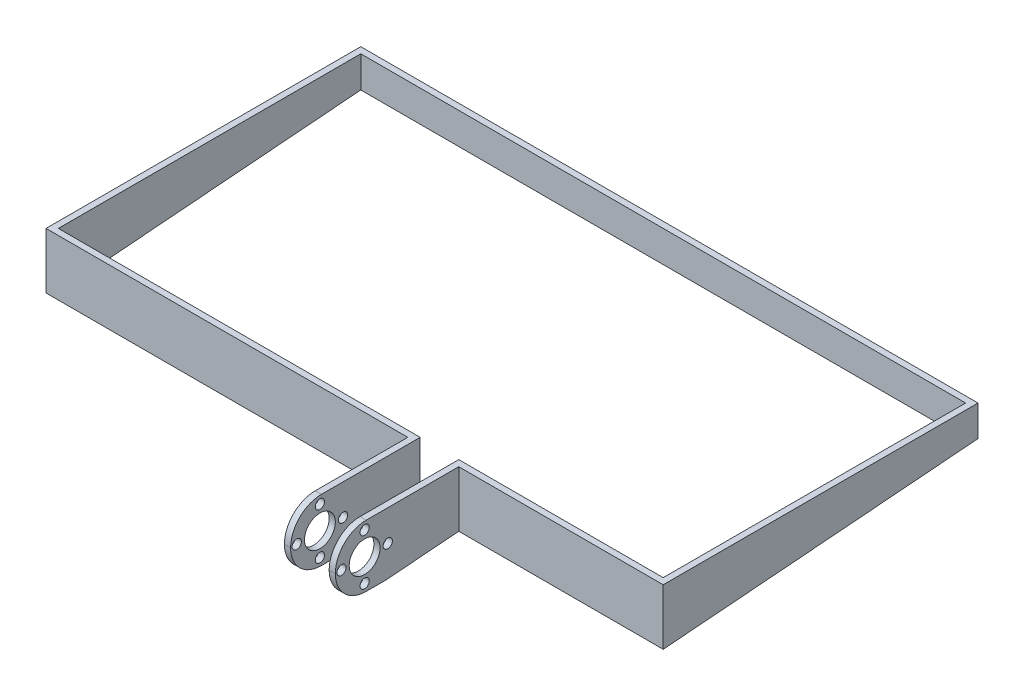
ISO-10303-21;
HEADER;
FILE_DESCRIPTION(('STEP AP214'),'2;1');
FILE_NAME('part.step','',(''),(''),'','','');
FILE_SCHEMA(('AUTOMOTIVE_DESIGN { 1 0 10303 214 1 1 1 1 }'));
ENDSEC;
DATA;
#1=APPLICATION_CONTEXT('core data for automotive mechanical design processes');
#2=APPLICATION_PROTOCOL_DEFINITION('international standard','automotive_design',2000,#1);
#3=PRODUCT_CONTEXT('',#1,'mechanical');
#4=PRODUCT('Part','Part','',(#3));
#5=PRODUCT_RELATED_PRODUCT_CATEGORY('part','',(#4));
#6=PRODUCT_DEFINITION_FORMATION('','',#4);
#7=PRODUCT_DEFINITION_CONTEXT('part definition',#1,'design');
#8=PRODUCT_DEFINITION('design','',#6,#7);
#9=PRODUCT_DEFINITION_SHAPE('','',#8);
#10=(LENGTH_UNIT() NAMED_UNIT(*) SI_UNIT(.MILLI.,.METRE.));
#11=(NAMED_UNIT(*) PLANE_ANGLE_UNIT() SI_UNIT($,.RADIAN.));
#12=(NAMED_UNIT(*) SI_UNIT($,.STERADIAN.) SOLID_ANGLE_UNIT());
#13=UNCERTAINTY_MEASURE_WITH_UNIT(LENGTH_MEASURE(1.E-05),#10,'distance_accuracy_value','');
#14=(GEOMETRIC_REPRESENTATION_CONTEXT(3) GLOBAL_UNCERTAINTY_ASSIGNED_CONTEXT((#13)) GLOBAL_UNIT_ASSIGNED_CONTEXT((#10,
#11,#12)) REPRESENTATION_CONTEXT('',''));
#15=CARTESIAN_POINT('',(0.,0.,0.));
#16=DIRECTION('',(0.,0.,1.));
#17=DIRECTION('',(1.,0.,0.));
#18=AXIS2_PLACEMENT_3D('',#15,#16,#17);
#19=CARTESIAN_POINT('',(-100.,20.,36.2145653136531));
#20=DIRECTION('',(1.,0.,0.));
#21=DIRECTION('',(0.,0.,-1.));
#22=AXIS2_PLACEMENT_3D('',#19,#20,#21);
#23=PLANE('',#22);
#24=DIRECTION('',(0.,-1.,0.));
#25=VECTOR('',#24,1.);
#26=CARTESIAN_POINT('',(-100.,20.,18.2145653136531));
#27=LINE('',#26,#25);
#28=CARTESIAN_POINT('',(-100.,20.,18.2145653136531));
#29=VERTEX_POINT('',#28);
#30=CARTESIAN_POINT('',(-100.,1.87829380653774,18.2145653136531));
#31=VERTEX_POINT('',#30);
#32=EDGE_CURVE('E200',#29,#31,#27,.T.);
#33=ORIENTED_EDGE('',*,*,#32,.F.);
#34=DIRECTION('',(0.,0.,1.));
#35=VECTOR('',#34,1.);
#36=CARTESIAN_POINT('',(-100.,20.,36.2145653136531));
#37=LINE('',#36,#35);
#38=CARTESIAN_POINT('',(-100.,20.,-83.7854346863469));
#39=VERTEX_POINT('',#38);
#40=EDGE_CURVE('E232',#39,#29,#37,.T.);
#41=ORIENTED_EDGE('',*,*,#40,.F.);
#42=DIRECTION('',(0.,-1.,0.));
#43=VECTOR('',#42,1.);
#44=CARTESIAN_POINT('',(-100.,20.,-83.7854346863469));
#45=LINE('',#44,#43);
#46=CARTESIAN_POINT('',(-99.9999999999999,10.,-83.7854346863469));
#47=VERTEX_POINT('',#46);
#48=EDGE_CURVE('E211',#39,#47,#45,.T.);
#49=ORIENTED_EDGE('',*,*,#48,.T.);
#50=DIRECTION('',(0.,-0.0793733516899173,0.996844958376933));
#51=VECTOR('',#50,1.);
#52=CARTESIAN_POINT('',(-100.,0.568250234196127,34.6673205840184));
#53=LINE('',#52,#51);
#54=EDGE_CURVE('E320',#47,#31,#53,.T.);
#55=ORIENTED_EDGE('',*,*,#54,.T.);
#56=EDGE_LOOP('',(#33,#41,#49,#55));
#57=FACE_BOUND('',#56,.T.);
#58=ADVANCED_FACE('F39',(#57),#23,.F.);
#59=CARTESIAN_POINT('',(100.,20.,36.2145653136531));
#60=DIRECTION('',(-1.,0.,0.));
#61=DIRECTION('',(0.,0.,1.));
#62=AXIS2_PLACEMENT_3D('',#59,#60,#61);
#63=PLANE('',#62);
#64=DIRECTION('',(0.,1.,0.));
#65=VECTOR('',#64,1.);
#66=CARTESIAN_POINT('',(100.,20.,18.2145653136531));
#67=LINE('',#66,#65);
#68=CARTESIAN_POINT('',(100.,1.87829380653775,18.2145653136531));
#69=VERTEX_POINT('',#68);
#70=CARTESIAN_POINT('',(100.,20.,18.2145653136531));
#71=VERTEX_POINT('',#70);
#72=EDGE_CURVE('E193',#69,#71,#67,.T.);
#73=ORIENTED_EDGE('',*,*,#72,.F.);
#74=DIRECTION('',(0.,0.0793733516899172,-0.996844958376933));
#75=VECTOR('',#74,1.);
#76=CARTESIAN_POINT('',(100.,0.,41.8039397262699));
#77=LINE('',#76,#75);
#78=CARTESIAN_POINT('',(100.,10.,-83.7854346863469));
#79=VERTEX_POINT('',#78);
#80=EDGE_CURVE('E436',#69,#79,#77,.T.);
#81=ORIENTED_EDGE('',*,*,#80,.T.);
#82=DIRECTION('',(0.,-1.,0.));
#83=VECTOR('',#82,1.);
#84=CARTESIAN_POINT('',(100.,20.,-83.7854346863469));
#85=LINE('',#84,#83);
#86=CARTESIAN_POINT('',(100.,20.,-83.7854346863469));
#87=VERTEX_POINT('',#86);
#88=EDGE_CURVE('E204',#87,#79,#85,.T.);
#89=ORIENTED_EDGE('',*,*,#88,.F.);
#90=DIRECTION('',(0.,0.,-1.));
#91=VECTOR('',#90,1.);
#92=CARTESIAN_POINT('',(100.,20.,36.2145653136531));
#93=LINE('',#92,#91);
#94=EDGE_CURVE('E180',#71,#87,#93,.T.);
#95=ORIENTED_EDGE('',*,*,#94,.F.);
#96=EDGE_LOOP('',(#73,#81,#89,#95));
#97=FACE_BOUND('',#96,.T.);
#98=ADVANCED_FACE('F202',(#97),#63,.F.);
#99=CARTESIAN_POINT('',(0.,20.,0.));
#100=DIRECTION('',(0.,-1.,0.));
#101=DIRECTION('',(0.,0.,-1.));
#102=AXIS2_PLACEMENT_3D('',#99,#100,#101);
#103=PLANE('',#102);
#104=DIRECTION('',(1.,0.,0.));
#105=VECTOR('',#104,1.);
#106=CARTESIAN_POINT('',(100.,20.,18.2145653136531));
#107=LINE('',#106,#105);
#108=CARTESIAN_POINT('',(17.25,20.,18.2145653136531));
#109=VERTEX_POINT('',#108);
#110=EDGE_CURVE('E453',#29,#109,#107,.T.);
#111=ORIENTED_EDGE('',*,*,#110,.T.);
#112=DIRECTION('',(0.,0.,1.));
#113=VECTOR('',#112,1.);
#114=CARTESIAN_POINT('',(17.25,20.,58.2145653136531));
#115=LINE('',#114,#113);
#116=CARTESIAN_POINT('',(17.25,20.,48.2145653136531));
#117=VERTEX_POINT('',#116);
#118=EDGE_CURVE('E390',#109,#117,#115,.T.);
#119=ORIENTED_EDGE('',*,*,#118,.T.);
#120=DIRECTION('',(1.,0.,0.));
#121=VECTOR('',#120,1.);
#122=CARTESIAN_POINT('',(0.,20.,48.2145653136531));
#123=LINE('',#122,#121);
#124=CARTESIAN_POINT('',(19.25,20.,48.2145653136531));
#125=VERTEX_POINT('',#124);
#126=EDGE_CURVE('E246',#117,#125,#123,.T.);
#127=ORIENTED_EDGE('',*,*,#126,.T.);
#128=DIRECTION('',(0.,0.,-1.));
#129=VECTOR('',#128,1.);
#130=CARTESIAN_POINT('',(19.25,20.,34.2145653136531));
#131=LINE('',#130,#129);
#132=CARTESIAN_POINT('',(19.25,20.,16.2145653136531));
#133=VERTEX_POINT('',#132);
#134=EDGE_CURVE('E394',#125,#133,#131,.T.);
#135=ORIENTED_EDGE('',*,*,#134,.T.);
#136=DIRECTION('',(-1.,0.,0.));
#137=VECTOR('',#136,1.);
#138=CARTESIAN_POINT('',(100.,20.,16.2145653136531));
#139=LINE('',#138,#137);
#140=CARTESIAN_POINT('',(-98.,20.,16.2145653136531));
#141=VERTEX_POINT('',#140);
#142=EDGE_CURVE('E63',#133,#141,#139,.T.);
#143=ORIENTED_EDGE('',*,*,#142,.T.);
#144=DIRECTION('',(0.,0.,-1.));
#145=VECTOR('',#144,1.);
#146=CARTESIAN_POINT('',(-98.,20.,34.2145653136531));
#147=LINE('',#146,#145);
#148=CARTESIAN_POINT('',(-98.,20.,-81.7854346863469));
#149=VERTEX_POINT('',#148);
#150=EDGE_CURVE('E397',#141,#149,#147,.T.);
#151=ORIENTED_EDGE('',*,*,#150,.T.);
#152=DIRECTION('',(1.,0.,0.));
#153=VECTOR('',#152,1.);
#154=CARTESIAN_POINT('',(-98.,20.,-81.7854346863469));
#155=LINE('',#154,#153);
#156=CARTESIAN_POINT('',(98.,20.,-81.7854346863469));
#157=VERTEX_POINT('',#156);
#158=EDGE_CURVE('E400',#149,#157,#155,.T.);
#159=ORIENTED_EDGE('',*,*,#158,.T.);
#160=DIRECTION('',(0.,0.,1.));
#161=VECTOR('',#160,1.);
#162=CARTESIAN_POINT('',(98.,20.,34.2145653136531));
#163=LINE('',#162,#161);
#164=CARTESIAN_POINT('',(98.,20.,16.2145653136531));
#165=VERTEX_POINT('',#164);
#166=EDGE_CURVE('E403',#157,#165,#163,.T.);
#167=ORIENTED_EDGE('',*,*,#166,.T.);
#168=DIRECTION('',(-1.,0.,0.));
#169=VECTOR('',#168,1.);
#170=CARTESIAN_POINT('',(100.,20.,16.2145653136531));
#171=LINE('',#170,#169);
#172=CARTESIAN_POINT('',(31.75,20.,16.2145653136531));
#173=VERTEX_POINT('',#172);
#174=EDGE_CURVE('E189',#165,#173,#171,.T.);
#175=ORIENTED_EDGE('',*,*,#174,.T.);
#176=DIRECTION('',(0.,0.,1.));
#177=VECTOR('',#176,1.);
#178=CARTESIAN_POINT('',(31.75,20.,34.2145653136531));
#179=LINE('',#178,#177);
#180=CARTESIAN_POINT('',(31.75,20.,48.2145653136531));
#181=VERTEX_POINT('',#180);
#182=EDGE_CURVE('E213',#173,#181,#179,.T.);
#183=ORIENTED_EDGE('',*,*,#182,.T.);
#184=DIRECTION('',(1.,0.,0.));
#185=VECTOR('',#184,1.);
#186=CARTESIAN_POINT('',(0.,20.,48.2145653136531));
#187=LINE('',#186,#185);
#188=CARTESIAN_POINT('',(33.75,20.,48.2145653136531));
#189=VERTEX_POINT('',#188);
#190=EDGE_CURVE('E279',#181,#189,#187,.T.);
#191=ORIENTED_EDGE('',*,*,#190,.T.);
#192=DIRECTION('',(0.,0.,-1.));
#193=VECTOR('',#192,1.);
#194=CARTESIAN_POINT('',(33.75,20.,58.2145653136531));
#195=LINE('',#194,#193);
#196=CARTESIAN_POINT('',(33.75,20.,18.2145653136531));
#197=VERTEX_POINT('',#196);
#198=EDGE_CURVE('E184',#189,#197,#195,.T.);
#199=ORIENTED_EDGE('',*,*,#198,.T.);
#200=DIRECTION('',(1.,0.,0.));
#201=VECTOR('',#200,1.);
#202=CARTESIAN_POINT('',(100.,20.,18.2145653136531));
#203=LINE('',#202,#201);
#204=EDGE_CURVE('E175',#197,#71,#203,.T.);
#205=ORIENTED_EDGE('',*,*,#204,.T.);
#206=ORIENTED_EDGE('',*,*,#94,.T.);
#207=DIRECTION('',(-1.,0.,0.));
#208=VECTOR('',#207,1.);
#209=CARTESIAN_POINT('',(-100.,20.,-83.7854346863469));
#210=LINE('',#209,#208);
#211=EDGE_CURVE('E207',#87,#39,#210,.T.);
#212=ORIENTED_EDGE('',*,*,#211,.T.);
#213=ORIENTED_EDGE('',*,*,#40,.T.);
#214=EDGE_LOOP('',(#111,#119,#127,#135,#143,#151,#159,#167,#175,#183,#191,#199,#205,#206,#212,#213));
#215=FACE_BOUND('',#214,.T.);
#216=ADVANCED_FACE('F178',(#215),#103,.F.);
#217=CARTESIAN_POINT('',(100.,0.,41.8039397262699));
#218=DIRECTION('',(0.,0.996844958376933,0.0793733516899172));
#219=DIRECTION('',(0.,-0.0793733516899173,0.996844958376933));
#220=AXIS2_PLACEMENT_3D('',#217,#218,#219);
#221=PLANE('',#220);
#222=DIRECTION('',(0.,-0.0793733516899173,0.996844958376933));
#223=VECTOR('',#222,1.);
#224=CARTESIAN_POINT('',(17.25,-1.17245412595848,56.5287177469316));
#225=LINE('',#224,#223);
#226=CARTESIAN_POINT('',(17.25,1.87829380653775,18.2145653136531));
#227=VERTEX_POINT('',#226);
#228=CARTESIAN_POINT('',(17.25,0.,41.8039397262699));
#229=VERTEX_POINT('',#228);
#230=EDGE_CURVE('E327',#227,#229,#225,.T.);
#231=ORIENTED_EDGE('',*,*,#230,.F.);
#232=DIRECTION('',(-1.,0.,0.));
#233=VECTOR('',#232,1.);
#234=CARTESIAN_POINT('',(100.,1.87829380653775,18.2145653136531));
#235=LINE('',#234,#233);
#236=EDGE_CURVE('E55',#227,#31,#235,.T.);
#237=ORIENTED_EDGE('',*,*,#236,.T.);
#238=ORIENTED_EDGE('',*,*,#54,.F.);
#239=DIRECTION('',(-1.,0.,0.));
#240=VECTOR('',#239,1.);
#241=CARTESIAN_POINT('',(100.,10.,-83.7854346863469));
#242=LINE('',#241,#240);
#243=EDGE_CURVE('E432',#79,#47,#242,.T.);
#244=ORIENTED_EDGE('',*,*,#243,.F.);
#245=ORIENTED_EDGE('',*,*,#80,.F.);
#246=DIRECTION('',(-1.,0.,0.));
#247=VECTOR('',#246,1.);
#248=CARTESIAN_POINT('',(100.,1.87829380653775,18.2145653136531));
#249=LINE('',#248,#247);
#250=CARTESIAN_POINT('',(33.75,1.87829380653775,18.2145653136531));
#251=VERTEX_POINT('',#250);
#252=EDGE_CURVE('E196',#69,#251,#249,.T.);
#253=ORIENTED_EDGE('',*,*,#252,.T.);
#254=DIRECTION('',(0.,0.0793733516899173,-0.996844958376933));
#255=VECTOR('',#254,1.);
#256=CARTESIAN_POINT('',(33.75,-1.17245412595848,56.5287177469316));
#257=LINE('',#256,#255);
#258=CARTESIAN_POINT('',(33.75,0.,41.8039397262699));
#259=VERTEX_POINT('',#258);
#260=EDGE_CURVE('E429',#259,#251,#257,.T.);
#261=ORIENTED_EDGE('',*,*,#260,.F.);
#262=DIRECTION('',(-1.,0.,0.));
#263=VECTOR('',#262,1.);
#264=CARTESIAN_POINT('',(0.,0.,41.8039397262699));
#265=LINE('',#264,#263);
#266=CARTESIAN_POINT('',(31.75,0.,41.8039397262699));
#267=VERTEX_POINT('',#266);
#268=EDGE_CURVE('E11',#259,#267,#265,.T.);
#269=ORIENTED_EDGE('',*,*,#268,.T.);
#270=DIRECTION('',(0.,-0.0793733516899173,0.996844958376933));
#271=VECTOR('',#270,1.);
#272=CARTESIAN_POINT('',(31.75,0.72649608511928,32.6799208419354));
#273=LINE('',#272,#271);
#274=CARTESIAN_POINT('',(31.75,2.03754294758602,16.2145653136531));
#275=VERTEX_POINT('',#274);
#276=EDGE_CURVE('E431',#275,#267,#273,.T.);
#277=ORIENTED_EDGE('',*,*,#276,.F.);
#278=DIRECTION('',(1.,0.,0.));
#279=VECTOR('',#278,1.);
#280=CARTESIAN_POINT('',(100.,2.03754294758602,16.2145653136531));
#281=LINE('',#280,#279);
#282=CARTESIAN_POINT('',(98.,2.03754294758602,16.2145653136531));
#283=VERTEX_POINT('',#282);
#284=EDGE_CURVE('E439',#275,#283,#281,.T.);
#285=ORIENTED_EDGE('',*,*,#284,.T.);
#286=DIRECTION('',(0.,-0.0793733516899173,0.996844958376933));
#287=VECTOR('',#286,1.);
#288=CARTESIAN_POINT('',(98.,0.72649608511928,32.6799208419354));
#289=LINE('',#288,#287);
#290=CARTESIAN_POINT('',(98.,9.84075085895173,-81.7854346863469));
#291=VERTEX_POINT('',#290);
#292=EDGE_CURVE('E483',#291,#283,#289,.T.);
#293=ORIENTED_EDGE('',*,*,#292,.F.);
#294=DIRECTION('',(1.,0.,0.));
#295=VECTOR('',#294,1.);
#296=CARTESIAN_POINT('',(-98.,9.84075085895172,-81.7854346863469));
#297=LINE('',#296,#295);
#298=CARTESIAN_POINT('',(-98.,9.84075085895172,-81.7854346863469));
#299=VERTEX_POINT('',#298);
#300=EDGE_CURVE('E487',#299,#291,#297,.T.);
#301=ORIENTED_EDGE('',*,*,#300,.F.);
#302=DIRECTION('',(0.,0.0793733516899173,-0.996844958376933));
#303=VECTOR('',#302,1.);
#304=CARTESIAN_POINT('',(-98.,0.72649608511928,32.6799208419354));
#305=LINE('',#304,#303);
#306=CARTESIAN_POINT('',(-97.9999999999999,2.03754294758602,16.2145653136531));
#307=VERTEX_POINT('',#306);
#308=EDGE_CURVE('E491',#307,#299,#305,.T.);
#309=ORIENTED_EDGE('',*,*,#308,.F.);
#310=DIRECTION('',(1.,0.,0.));
#311=VECTOR('',#310,1.);
#312=CARTESIAN_POINT('',(100.,2.03754294758602,16.2145653136531));
#313=LINE('',#312,#311);
#314=CARTESIAN_POINT('',(19.25,2.03754294758602,16.2145653136531));
#315=VERTEX_POINT('',#314);
#316=EDGE_CURVE('E462',#307,#315,#313,.T.);
#317=ORIENTED_EDGE('',*,*,#316,.T.);
#318=DIRECTION('',(0.,0.0793733516899173,-0.996844958376933));
#319=VECTOR('',#318,1.);
#320=CARTESIAN_POINT('',(19.25,0.72649608511928,32.6799208419354));
#321=LINE('',#320,#319);
#322=CARTESIAN_POINT('',(19.25,0.,41.8039397262699));
#323=VERTEX_POINT('',#322);
#324=EDGE_CURVE('E333',#323,#315,#321,.T.);
#325=ORIENTED_EDGE('',*,*,#324,.F.);
#326=EDGE_CURVE('E43',#323,#229,#265,.T.);
#327=ORIENTED_EDGE('',*,*,#326,.T.);
#328=EDGE_LOOP('',(#231,#237,#238,#244,#245,#253,#261,#269,#277,#285,#293,#301,#309,#317,#325,#327));
#329=FACE_BOUND('',#328,.T.);
#330=ADVANCED_FACE('F434',(#329),#221,.F.);
#331=CARTESIAN_POINT('',(-98.,20.,34.2145653136531));
#332=DIRECTION('',(-1.,0.,0.));
#333=DIRECTION('',(0.,0.,1.));
#334=AXIS2_PLACEMENT_3D('',#331,#332,#333);
#335=PLANE('',#334);
#336=ORIENTED_EDGE('',*,*,#150,.F.);
#337=DIRECTION('',(0.,-1.,0.));
#338=VECTOR('',#337,1.);
#339=CARTESIAN_POINT('',(-98.,20.,16.2145653136531));
#340=LINE('',#339,#338);
#341=EDGE_CURVE('E459',#141,#307,#340,.T.);
#342=ORIENTED_EDGE('',*,*,#341,.T.);
#343=ORIENTED_EDGE('',*,*,#308,.T.);
#344=DIRECTION('',(0.,-1.,0.));
#345=VECTOR('',#344,1.);
#346=CARTESIAN_POINT('',(-98.,20.,-81.7854346863469));
#347=LINE('',#346,#345);
#348=EDGE_CURVE('E242',#149,#299,#347,.T.);
#349=ORIENTED_EDGE('',*,*,#348,.F.);
#350=EDGE_LOOP('',(#336,#342,#343,#349));
#351=FACE_BOUND('',#350,.T.);
#352=ADVANCED_FACE('F507',(#351),#335,.F.);
#353=CARTESIAN_POINT('',(0.,0.,0.));
#354=DIRECTION('',(0.,-1.,0.));
#355=DIRECTION('',(0.,0.,-1.));
#356=AXIS2_PLACEMENT_3D('',#353,#354,#355);
#357=PLANE('',#356);
#358=ORIENTED_EDGE('',*,*,#268,.F.);
#359=DIRECTION('',(0.,0.,-1.));
#360=VECTOR('',#359,1.);
#361=CARTESIAN_POINT('',(33.75,0.,58.2145653136531));
#362=LINE('',#361,#360);
#363=CARTESIAN_POINT('',(33.75,0.,48.2145653136531));
#364=VERTEX_POINT('',#363);
#365=EDGE_CURVE('E228',#364,#259,#362,.T.);
#366=ORIENTED_EDGE('',*,*,#365,.F.);
#367=DIRECTION('',(1.,0.,0.));
#368=VECTOR('',#367,1.);
#369=CARTESIAN_POINT('',(31.75,0.,48.2145653136531));
#370=LINE('',#369,#368);
#371=CARTESIAN_POINT('',(31.75,0.,48.2145653136531));
#372=VERTEX_POINT('',#371);
#373=EDGE_CURVE('E299',#364,#372,#370,.F.);
#374=ORIENTED_EDGE('',*,*,#373,.T.);
#375=DIRECTION('',(0.,0.,1.));
#376=VECTOR('',#375,1.);
#377=CARTESIAN_POINT('',(31.75,0.,34.2145653136531));
#378=LINE('',#377,#376);
#379=EDGE_CURVE('E225',#267,#372,#378,.T.);
#380=ORIENTED_EDGE('',*,*,#379,.F.);
#381=EDGE_LOOP('',(#358,#366,#374,#380));
#382=FACE_BOUND('',#381,.T.);
#383=ADVANCED_FACE('F428',(#382),#357,.T.);
#384=CARTESIAN_POINT('',(17.25,20.,58.2145653136531));
#385=DIRECTION('',(1.,0.,0.));
#386=DIRECTION('',(0.,0.,-1.));
#387=AXIS2_PLACEMENT_3D('',#384,#385,#386);
#388=PLANE('',#387);
#389=CARTESIAN_POINT('',(17.25,9.99999999999998,41.2145653136531));
#390=DIRECTION('',(1.,0.,0.));
#391=DIRECTION('',(0.,0.,-1.));
#392=AXIS2_PLACEMENT_3D('',#389,#390,#391);
#393=CIRCLE('',#392,1.5);
#394=CARTESIAN_POINT('',(17.25,9.99999999999998,39.7145653136531));
#395=VERTEX_POINT('',#394);
#396=EDGE_CURVE('E258',#395,#395,#393,.T.);
#397=ORIENTED_EDGE('',*,*,#396,.T.);
#398=EDGE_LOOP('',(#397));
#399=FACE_BOUND('',#398,.T.);
#400=CARTESIAN_POINT('',(17.25,2.5,48.7145653136531));
#401=DIRECTION('',(1.,0.,0.));
#402=DIRECTION('',(0.,0.,-1.));
#403=AXIS2_PLACEMENT_3D('',#400,#401,#402);
#404=CIRCLE('',#403,1.5);
#405=CARTESIAN_POINT('',(17.25,2.5,47.2145653136531));
#406=VERTEX_POINT('',#405);
#407=EDGE_CURVE('E276',#406,#406,#404,.T.);
#408=ORIENTED_EDGE('',*,*,#407,.T.);
#409=EDGE_LOOP('',(#408));
#410=FACE_BOUND('',#409,.T.);
#411=CARTESIAN_POINT('',(17.25,10.0000000000001,56.2145653136531));
#412=DIRECTION('',(1.,0.,0.));
#413=DIRECTION('',(0.,0.,-1.));
#414=AXIS2_PLACEMENT_3D('',#411,#412,#413);
#415=CIRCLE('',#414,1.5);
#416=CARTESIAN_POINT('',(17.25,10.0000000000001,54.7145653136531));
#417=VERTEX_POINT('',#416);
#418=EDGE_CURVE('E270',#417,#417,#415,.T.);
#419=ORIENTED_EDGE('',*,*,#418,.T.);
#420=EDGE_LOOP('',(#419));
#421=FACE_BOUND('',#420,.T.);
#422=CARTESIAN_POINT('',(17.25,17.5,48.7145653136531));
#423=DIRECTION('',(1.,0.,0.));
#424=DIRECTION('',(0.,0.,-1.));
#425=AXIS2_PLACEMENT_3D('',#422,#423,#424);
#426=CIRCLE('',#425,1.5);
#427=CARTESIAN_POINT('',(17.25,17.5,47.2145653136531));
#428=VERTEX_POINT('',#427);
#429=EDGE_CURVE('E252',#428,#428,#426,.T.);
#430=ORIENTED_EDGE('',*,*,#429,.T.);
#431=EDGE_LOOP('',(#430));
#432=FACE_BOUND('',#431,.T.);
#433=CARTESIAN_POINT('',(17.25,10.,48.7145653136531));
#434=DIRECTION('',(1.,0.,0.));
#435=DIRECTION('',(0.,0.,-1.));
#436=AXIS2_PLACEMENT_3D('',#433,#434,#435);
#437=CIRCLE('',#436,5.);
#438=CARTESIAN_POINT('',(17.25,10.,43.7145653136531));
#439=VERTEX_POINT('',#438);
#440=EDGE_CURVE('E221',#439,#439,#437,.T.);
#441=ORIENTED_EDGE('',*,*,#440,.T.);
#442=EDGE_LOOP('',(#441));
#443=FACE_BOUND('',#442,.T.);
#444=ORIENTED_EDGE('',*,*,#118,.F.);
#445=DIRECTION('',(0.,-1.,0.));
#446=VECTOR('',#445,1.);
#447=CARTESIAN_POINT('',(17.25,141.563000917651,18.2145653136531));
#448=LINE('',#447,#446);
#449=EDGE_CURVE('E466',#109,#227,#448,.T.);
#450=ORIENTED_EDGE('',*,*,#449,.T.);
#451=ORIENTED_EDGE('',*,*,#230,.T.);
#452=DIRECTION('',(0.,0.,1.));
#453=VECTOR('',#452,1.);
#454=CARTESIAN_POINT('',(17.25,0.,58.2145653136531));
#455=LINE('',#454,#453);
#456=CARTESIAN_POINT('',(17.25,0.,48.2145653136531));
#457=VERTEX_POINT('',#456);
#458=EDGE_CURVE('E217',#229,#457,#455,.T.);
#459=ORIENTED_EDGE('',*,*,#458,.T.);
#460=CARTESIAN_POINT('',(17.25,10.,48.2145653136531));
#461=DIRECTION('',(1.,0.,0.));
#462=DIRECTION('',(0.,0.,-1.));
#463=AXIS2_PLACEMENT_3D('',#460,#461,#462);
#464=CIRCLE('',#463,10.);
#465=CARTESIAN_POINT('',(17.25,10.,58.2145653136531));
#466=VERTEX_POINT('',#465);
#467=EDGE_CURVE('E312',#457,#466,#464,.F.);
#468=ORIENTED_EDGE('',*,*,#467,.T.);
#469=CARTESIAN_POINT('',(17.25,10.,48.2145653136531));
#470=DIRECTION('',(1.,0.,0.));
#471=DIRECTION('',(0.,0.,-1.));
#472=AXIS2_PLACEMENT_3D('',#469,#470,#471);
#473=CIRCLE('',#472,10.);
#474=EDGE_CURVE('E309',#466,#117,#473,.F.);
#475=ORIENTED_EDGE('',*,*,#474,.T.);
#476=EDGE_LOOP('',(#444,#450,#451,#459,#468,#475));
#477=FACE_BOUND('',#476,.T.);
#478=ADVANCED_FACE('F551',(#399,#410,#421,#432,#443,#477),#388,.F.);
#479=CARTESIAN_POINT('',(19.25,20.,34.2145653136531));
#480=DIRECTION('',(-1.,0.,0.));
#481=DIRECTION('',(0.,0.,1.));
#482=AXIS2_PLACEMENT_3D('',#479,#480,#481);
#483=PLANE('',#482);
#484=CARTESIAN_POINT('',(19.25,9.99999999999998,41.2145653136531));
#485=DIRECTION('',(-1.,0.,0.));
#486=DIRECTION('',(0.,0.,1.));
#487=AXIS2_PLACEMENT_3D('',#484,#485,#486);
#488=CIRCLE('',#487,1.5);
#489=CARTESIAN_POINT('',(19.25,9.99999999999998,42.7145653136531));
#490=VERTEX_POINT('',#489);
#491=EDGE_CURVE('E360',#490,#490,#488,.T.);
#492=ORIENTED_EDGE('',*,*,#491,.T.);
#493=EDGE_LOOP('',(#492));
#494=FACE_BOUND('',#493,.T.);
#495=CARTESIAN_POINT('',(19.25,2.5,48.7145653136531));
#496=DIRECTION('',(-1.,0.,0.));
#497=DIRECTION('',(0.,0.,1.));
#498=AXIS2_PLACEMENT_3D('',#495,#496,#497);
#499=CIRCLE('',#498,1.5);
#500=CARTESIAN_POINT('',(19.25,2.5,50.2145653136531));
#501=VERTEX_POINT('',#500);
#502=EDGE_CURVE('E350',#501,#501,#499,.T.);
#503=ORIENTED_EDGE('',*,*,#502,.T.);
#504=EDGE_LOOP('',(#503));
#505=FACE_BOUND('',#504,.T.);
#506=CARTESIAN_POINT('',(19.25,10.0000000000001,56.2145653136531));
#507=DIRECTION('',(-1.,0.,0.));
#508=DIRECTION('',(0.,0.,1.));
#509=AXIS2_PLACEMENT_3D('',#506,#507,#508);
#510=CIRCLE('',#509,1.5);
#511=CARTESIAN_POINT('',(19.25,10.0000000000001,57.7145653136531));
#512=VERTEX_POINT('',#511);
#513=EDGE_CURVE('E340',#512,#512,#510,.T.);
#514=ORIENTED_EDGE('',*,*,#513,.T.);
#515=EDGE_LOOP('',(#514));
#516=FACE_BOUND('',#515,.T.);
#517=CARTESIAN_POINT('',(19.25,17.5,48.7145653136531));
#518=DIRECTION('',(-1.,0.,0.));
#519=DIRECTION('',(0.,0.,1.));
#520=AXIS2_PLACEMENT_3D('',#517,#518,#519);
#521=CIRCLE('',#520,1.5);
#522=CARTESIAN_POINT('',(19.25,17.5,50.2145653136531));
#523=VERTEX_POINT('',#522);
#524=EDGE_CURVE('E370',#523,#523,#521,.T.);
#525=ORIENTED_EDGE('',*,*,#524,.T.);
#526=EDGE_LOOP('',(#525));
#527=FACE_BOUND('',#526,.T.);
#528=CARTESIAN_POINT('',(19.25,10.,48.7145653136531));
#529=DIRECTION('',(-1.,0.,0.));
#530=DIRECTION('',(0.,0.,1.));
#531=AXIS2_PLACEMENT_3D('',#528,#529,#530);
#532=CIRCLE('',#531,5.);
#533=CARTESIAN_POINT('',(19.25,10.,53.7145653136531));
#534=VERTEX_POINT('',#533);
#535=EDGE_CURVE('E380',#534,#534,#532,.T.);
#536=ORIENTED_EDGE('',*,*,#535,.T.);
#537=EDGE_LOOP('',(#536));
#538=FACE_BOUND('',#537,.T.);
#539=ORIENTED_EDGE('',*,*,#324,.T.);
#540=DIRECTION('',(0.,-1.,0.));
#541=VECTOR('',#540,1.);
#542=CARTESIAN_POINT('',(19.25,141.722250058699,16.2145653136531));
#543=LINE('',#542,#541);
#544=EDGE_CURVE('E456',#133,#315,#543,.T.);
#545=ORIENTED_EDGE('',*,*,#544,.F.);
#546=ORIENTED_EDGE('',*,*,#134,.F.);
#547=CARTESIAN_POINT('',(19.25,10.,48.2145653136531));
#548=DIRECTION('',(-1.,0.,0.));
#549=DIRECTION('',(0.,0.,1.));
#550=AXIS2_PLACEMENT_3D('',#547,#548,#549);
#551=CIRCLE('',#550,10.);
#552=CARTESIAN_POINT('',(19.25,10.,58.2145653136531));
#553=VERTEX_POINT('',#552);
#554=EDGE_CURVE('E303',#125,#553,#551,.F.);
#555=ORIENTED_EDGE('',*,*,#554,.T.);
#556=CARTESIAN_POINT('',(19.25,10.,48.2145653136531));
#557=DIRECTION('',(-1.,0.,0.));
#558=DIRECTION('',(0.,0.,1.));
#559=AXIS2_PLACEMENT_3D('',#556,#557,#558);
#560=CIRCLE('',#559,10.);
#561=CARTESIAN_POINT('',(19.25,0.,48.2145653136531));
#562=VERTEX_POINT('',#561);
#563=EDGE_CURVE('E306',#553,#562,#560,.F.);
#564=ORIENTED_EDGE('',*,*,#563,.T.);
#565=DIRECTION('',(0.,0.,-1.));
#566=VECTOR('',#565,1.);
#567=CARTESIAN_POINT('',(19.25,0.,34.2145653136531));
#568=LINE('',#567,#566);
#569=EDGE_CURVE('E220',#562,#323,#568,.T.);
#570=ORIENTED_EDGE('',*,*,#569,.T.);
#571=EDGE_LOOP('',(#539,#545,#546,#555,#564,#570));
#572=FACE_BOUND('',#571,.T.);
#573=ADVANCED_FACE('F496',(#494,#505,#516,#527,#538,#572),#483,.F.);
#574=CARTESIAN_POINT('',(-98.,20.,-81.7854346863469));
#575=DIRECTION('',(0.,0.,-1.));
#576=DIRECTION('',(-1.,0.,0.));
#577=AXIS2_PLACEMENT_3D('',#574,#575,#576);
#578=PLANE('',#577);
#579=ORIENTED_EDGE('',*,*,#348,.T.);
#580=ORIENTED_EDGE('',*,*,#300,.T.);
#581=DIRECTION('',(0.,-1.,0.));
#582=VECTOR('',#581,1.);
#583=CARTESIAN_POINT('',(98.,20.,-81.7854346863469));
#584=LINE('',#583,#582);
#585=EDGE_CURVE('E238',#157,#291,#584,.T.);
#586=ORIENTED_EDGE('',*,*,#585,.F.);
#587=ORIENTED_EDGE('',*,*,#158,.F.);
#588=EDGE_LOOP('',(#579,#580,#586,#587));
#589=FACE_BOUND('',#588,.T.);
#590=ADVANCED_FACE('F512',(#589),#578,.F.);
#591=CARTESIAN_POINT('',(98.,20.,34.2145653136531));
#592=DIRECTION('',(1.,0.,0.));
#593=DIRECTION('',(0.,0.,-1.));
#594=AXIS2_PLACEMENT_3D('',#591,#592,#593);
#595=PLANE('',#594);
#596=ORIENTED_EDGE('',*,*,#292,.T.);
#597=DIRECTION('',(0.,1.,0.));
#598=VECTOR('',#597,1.);
#599=CARTESIAN_POINT('',(98.,20.,16.2145653136531));
#600=LINE('',#599,#598);
#601=EDGE_CURVE('E449',#283,#165,#600,.T.);
#602=ORIENTED_EDGE('',*,*,#601,.T.);
#603=ORIENTED_EDGE('',*,*,#166,.F.);
#604=ORIENTED_EDGE('',*,*,#585,.T.);
#605=EDGE_LOOP('',(#596,#602,#603,#604));
#606=FACE_BOUND('',#605,.T.);
#607=ADVANCED_FACE('F514',(#606),#595,.F.);
#608=CARTESIAN_POINT('',(31.75,20.,34.2145653136531));
#609=DIRECTION('',(1.,0.,0.));
#610=DIRECTION('',(0.,0.,-1.));
#611=AXIS2_PLACEMENT_3D('',#608,#609,#610);
#612=PLANE('',#611);
#613=CARTESIAN_POINT('',(31.75,9.99999999999998,41.2145653136531));
#614=DIRECTION('',(1.,0.,0.));
#615=DIRECTION('',(0.,0.,-1.));
#616=AXIS2_PLACEMENT_3D('',#613,#614,#615);
#617=CIRCLE('',#616,1.5);
#618=CARTESIAN_POINT('',(31.75,9.99999999999998,39.7145653136531));
#619=VERTEX_POINT('',#618);
#620=EDGE_CURVE('E275',#619,#619,#617,.T.);
#621=ORIENTED_EDGE('',*,*,#620,.T.);
#622=EDGE_LOOP('',(#621));
#623=FACE_BOUND('',#622,.T.);
#624=CARTESIAN_POINT('',(31.75,2.5,48.7145653136531));
#625=DIRECTION('',(1.,0.,0.));
#626=DIRECTION('',(0.,0.,-1.));
#627=AXIS2_PLACEMENT_3D('',#624,#625,#626);
#628=CIRCLE('',#627,1.5);
#629=CARTESIAN_POINT('',(31.75,2.5,47.2145653136531));
#630=VERTEX_POINT('',#629);
#631=EDGE_CURVE('E269',#630,#630,#628,.T.);
#632=ORIENTED_EDGE('',*,*,#631,.T.);
#633=EDGE_LOOP('',(#632));
#634=FACE_BOUND('',#633,.T.);
#635=CARTESIAN_POINT('',(31.75,10.0000000000001,56.2145653136531));
#636=DIRECTION('',(1.,0.,0.));
#637=DIRECTION('',(0.,0.,-1.));
#638=AXIS2_PLACEMENT_3D('',#635,#636,#637);
#639=CIRCLE('',#638,1.5);
#640=CARTESIAN_POINT('',(31.75,10.0000000000001,54.7145653136531));
#641=VERTEX_POINT('',#640);
#642=EDGE_CURVE('E263',#641,#641,#639,.T.);
#643=ORIENTED_EDGE('',*,*,#642,.T.);
#644=EDGE_LOOP('',(#643));
#645=FACE_BOUND('',#644,.T.);
#646=CARTESIAN_POINT('',(31.75,17.5,48.7145653136531));
#647=DIRECTION('',(1.,0.,0.));
#648=DIRECTION('',(0.,0.,-1.));
#649=AXIS2_PLACEMENT_3D('',#646,#647,#648);
#650=CIRCLE('',#649,1.5);
#651=CARTESIAN_POINT('',(31.75,17.5,47.2145653136531));
#652=VERTEX_POINT('',#651);
#653=EDGE_CURVE('E257',#652,#652,#650,.T.);
#654=ORIENTED_EDGE('',*,*,#653,.T.);
#655=EDGE_LOOP('',(#654));
#656=FACE_BOUND('',#655,.T.);
#657=CARTESIAN_POINT('',(31.75,10.,48.7145653136531));
#658=DIRECTION('',(1.,0.,0.));
#659=DIRECTION('',(0.,0.,-1.));
#660=AXIS2_PLACEMENT_3D('',#657,#658,#659);
#661=CIRCLE('',#660,5.);
#662=CARTESIAN_POINT('',(31.75,10.,43.7145653136531));
#663=VERTEX_POINT('',#662);
#664=EDGE_CURVE('E251',#663,#663,#661,.T.);
#665=ORIENTED_EDGE('',*,*,#664,.T.);
#666=EDGE_LOOP('',(#665));
#667=FACE_BOUND('',#666,.T.);
#668=CARTESIAN_POINT('',(31.75,10.,48.2145653136531));
#669=DIRECTION('',(1.,0.,0.));
#670=DIRECTION('',(0.,0.,-1.));
#671=AXIS2_PLACEMENT_3D('',#668,#669,#670);
#672=CIRCLE('',#671,10.);
#673=CARTESIAN_POINT('',(31.75,10.,58.2145653136531));
#674=VERTEX_POINT('',#673);
#675=EDGE_CURVE('E291',#674,#181,#672,.F.);
#676=ORIENTED_EDGE('',*,*,#675,.T.);
#677=ORIENTED_EDGE('',*,*,#182,.F.);
#678=DIRECTION('',(0.,-1.,0.));
#679=VECTOR('',#678,1.);
#680=CARTESIAN_POINT('',(31.75,141.722250058699,16.2145653136531));
#681=LINE('',#680,#679);
#682=EDGE_CURVE('E438',#173,#275,#681,.T.);
#683=ORIENTED_EDGE('',*,*,#682,.T.);
#684=ORIENTED_EDGE('',*,*,#276,.T.);
#685=ORIENTED_EDGE('',*,*,#379,.T.);
#686=CARTESIAN_POINT('',(31.75,10.,48.2145653136531));
#687=DIRECTION('',(1.,0.,0.));
#688=DIRECTION('',(0.,0.,-1.));
#689=AXIS2_PLACEMENT_3D('',#686,#687,#688);
#690=CIRCLE('',#689,10.);
#691=EDGE_CURVE('E288',#372,#674,#690,.F.);
#692=ORIENTED_EDGE('',*,*,#691,.T.);
#693=EDGE_LOOP('',(#676,#677,#683,#684,#685,#692));
#694=FACE_BOUND('',#693,.T.);
#695=ADVANCED_FACE('F413',(#623,#634,#645,#656,#667,#694),#612,.F.);
#696=CARTESIAN_POINT('',(33.75,20.,58.2145653136531));
#697=DIRECTION('',(-1.,0.,0.));
#698=DIRECTION('',(0.,0.,1.));
#699=AXIS2_PLACEMENT_3D('',#696,#697,#698);
#700=PLANE('',#699);
#701=CARTESIAN_POINT('',(33.75,9.99999999999998,41.2145653136531));
#702=DIRECTION('',(-1.,0.,0.));
#703=DIRECTION('',(0.,0.,1.));
#704=AXIS2_PLACEMENT_3D('',#701,#702,#703);
#705=CIRCLE('',#704,1.5);
#706=CARTESIAN_POINT('',(33.75,9.99999999999998,42.7145653136531));
#707=VERTEX_POINT('',#706);
#708=EDGE_CURVE('E271',#707,#707,#705,.T.);
#709=ORIENTED_EDGE('',*,*,#708,.T.);
#710=EDGE_LOOP('',(#709));
#711=FACE_BOUND('',#710,.T.);
#712=CARTESIAN_POINT('',(33.75,2.5,48.7145653136531));
#713=DIRECTION('',(-1.,0.,0.));
#714=DIRECTION('',(0.,0.,1.));
#715=AXIS2_PLACEMENT_3D('',#712,#713,#714);
#716=CIRCLE('',#715,1.5);
#717=CARTESIAN_POINT('',(33.75,2.5,50.2145653136531));
#718=VERTEX_POINT('',#717);
#719=EDGE_CURVE('E265',#718,#718,#716,.T.);
#720=ORIENTED_EDGE('',*,*,#719,.T.);
#721=EDGE_LOOP('',(#720));
#722=FACE_BOUND('',#721,.T.);
#723=CARTESIAN_POINT('',(33.75,10.0000000000001,56.2145653136531));
#724=DIRECTION('',(-1.,0.,0.));
#725=DIRECTION('',(0.,0.,1.));
#726=AXIS2_PLACEMENT_3D('',#723,#724,#725);
#727=CIRCLE('',#726,1.5);
#728=CARTESIAN_POINT('',(33.75,10.0000000000001,57.7145653136531));
#729=VERTEX_POINT('',#728);
#730=EDGE_CURVE('E259',#729,#729,#727,.T.);
#731=ORIENTED_EDGE('',*,*,#730,.T.);
#732=EDGE_LOOP('',(#731));
#733=FACE_BOUND('',#732,.T.);
#734=CARTESIAN_POINT('',(33.75,17.5,48.7145653136531));
#735=DIRECTION('',(-1.,0.,0.));
#736=DIRECTION('',(0.,0.,1.));
#737=AXIS2_PLACEMENT_3D('',#734,#735,#736);
#738=CIRCLE('',#737,1.5);
#739=CARTESIAN_POINT('',(33.75,17.5,50.2145653136531));
#740=VERTEX_POINT('',#739);
#741=EDGE_CURVE('E253',#740,#740,#738,.T.);
#742=ORIENTED_EDGE('',*,*,#741,.T.);
#743=EDGE_LOOP('',(#742));
#744=FACE_BOUND('',#743,.T.);
#745=CARTESIAN_POINT('',(33.75,10.,48.7145653136531));
#746=DIRECTION('',(-1.,0.,0.));
#747=DIRECTION('',(0.,0.,1.));
#748=AXIS2_PLACEMENT_3D('',#745,#746,#747);
#749=CIRCLE('',#748,5.);
#750=CARTESIAN_POINT('',(33.75,10.,53.7145653136531));
#751=VERTEX_POINT('',#750);
#752=EDGE_CURVE('E247',#751,#751,#749,.T.);
#753=ORIENTED_EDGE('',*,*,#752,.T.);
#754=EDGE_LOOP('',(#753));
#755=FACE_BOUND('',#754,.T.);
#756=ORIENTED_EDGE('',*,*,#365,.T.);
#757=ORIENTED_EDGE('',*,*,#260,.T.);
#758=DIRECTION('',(0.,-1.,0.));
#759=VECTOR('',#758,1.);
#760=CARTESIAN_POINT('',(33.75,141.563000917651,18.2145653136531));
#761=LINE('',#760,#759);
#762=EDGE_CURVE('E190',#197,#251,#761,.T.);
#763=ORIENTED_EDGE('',*,*,#762,.F.);
#764=ORIENTED_EDGE('',*,*,#198,.F.);
#765=CARTESIAN_POINT('',(33.75,10.,48.2145653136531));
#766=DIRECTION('',(-1.,0.,0.));
#767=DIRECTION('',(0.,0.,1.));
#768=AXIS2_PLACEMENT_3D('',#765,#766,#767);
#769=CIRCLE('',#768,10.);
#770=CARTESIAN_POINT('',(33.75,10.,58.2145653136531));
#771=VERTEX_POINT('',#770);
#772=EDGE_CURVE('E285',#189,#771,#769,.F.);
#773=ORIENTED_EDGE('',*,*,#772,.T.);
#774=CARTESIAN_POINT('',(33.75,10.,48.2145653136531));
#775=DIRECTION('',(-1.,0.,0.));
#776=DIRECTION('',(0.,0.,1.));
#777=AXIS2_PLACEMENT_3D('',#774,#775,#776);
#778=CIRCLE('',#777,10.);
#779=EDGE_CURVE('E282',#771,#364,#778,.F.);
#780=ORIENTED_EDGE('',*,*,#779,.T.);
#781=EDGE_LOOP('',(#756,#757,#763,#764,#773,#780));
#782=FACE_BOUND('',#781,.T.);
#783=ADVANCED_FACE('F420',(#711,#722,#733,#744,#755,#782),#700,.F.);
#784=CARTESIAN_POINT('',(-100.,20.,-83.7854346863469));
#785=DIRECTION('',(0.,0.,1.));
#786=DIRECTION('',(1.,0.,0.));
#787=AXIS2_PLACEMENT_3D('',#784,#785,#786);
#788=PLANE('',#787);
#789=ORIENTED_EDGE('',*,*,#88,.T.);
#790=ORIENTED_EDGE('',*,*,#243,.T.);
#791=ORIENTED_EDGE('',*,*,#48,.F.);
#792=ORIENTED_EDGE('',*,*,#211,.F.);
#793=EDGE_LOOP('',(#789,#790,#791,#792));
#794=FACE_BOUND('',#793,.T.);
#795=ADVANCED_FACE('F528',(#794),#788,.F.);
#796=ORIENTED_EDGE('',*,*,#326,.F.);
#797=ORIENTED_EDGE('',*,*,#569,.F.);
#798=DIRECTION('',(1.,0.,0.));
#799=VECTOR('',#798,1.);
#800=CARTESIAN_POINT('',(17.25,0.,48.2145653136531));
#801=LINE('',#800,#799);
#802=EDGE_CURVE('E295',#562,#457,#801,.F.);
#803=ORIENTED_EDGE('',*,*,#802,.T.);
#804=ORIENTED_EDGE('',*,*,#458,.F.);
#805=EDGE_LOOP('',(#796,#797,#803,#804));
#806=FACE_BOUND('',#805,.T.);
#807=ADVANCED_FACE('F530',(#806),#357,.T.);
#808=CARTESIAN_POINT('',(-100.,10.,48.7145653136531));
#809=DIRECTION('',(1.,0.,0.));
#810=DIRECTION('',(0.,0.,-1.));
#811=AXIS2_PLACEMENT_3D('',#808,#809,#810);
#812=CYLINDRICAL_SURFACE('',#811,5.);
#813=ORIENTED_EDGE('',*,*,#752,.F.);
#814=EDGE_LOOP('',(#813));
#815=FACE_BOUND('',#814,.T.);
#816=ORIENTED_EDGE('',*,*,#664,.F.);
#817=EDGE_LOOP('',(#816));
#818=FACE_BOUND('',#817,.T.);
#819=ADVANCED_FACE('F536',(#815,#818),#812,.F.);
#820=ORIENTED_EDGE('',*,*,#535,.F.);
#821=EDGE_LOOP('',(#820));
#822=FACE_BOUND('',#821,.T.);
#823=ORIENTED_EDGE('',*,*,#440,.F.);
#824=EDGE_LOOP('',(#823));
#825=FACE_BOUND('',#824,.T.);
#826=ADVANCED_FACE('F591',(#822,#825),#812,.F.);
#827=CARTESIAN_POINT('',(-100.,17.5,48.7145653136531));
#828=DIRECTION('',(1.,0.,0.));
#829=DIRECTION('',(0.,0.,-1.));
#830=AXIS2_PLACEMENT_3D('',#827,#828,#829);
#831=CYLINDRICAL_SURFACE('',#830,1.5);
#832=ORIENTED_EDGE('',*,*,#741,.F.);
#833=EDGE_LOOP('',(#832));
#834=FACE_BOUND('',#833,.T.);
#835=ORIENTED_EDGE('',*,*,#653,.F.);
#836=EDGE_LOOP('',(#835));
#837=FACE_BOUND('',#836,.T.);
#838=ADVANCED_FACE('F593',(#834,#837),#831,.F.);
#839=ORIENTED_EDGE('',*,*,#524,.F.);
#840=EDGE_LOOP('',(#839));
#841=FACE_BOUND('',#840,.T.);
#842=ORIENTED_EDGE('',*,*,#429,.F.);
#843=EDGE_LOOP('',(#842));
#844=FACE_BOUND('',#843,.T.);
#845=ADVANCED_FACE('F600',(#841,#844),#831,.F.);
#846=CARTESIAN_POINT('',(-100.,10.0000000000001,56.2145653136531));
#847=DIRECTION('',(1.,0.,0.));
#848=DIRECTION('',(0.,0.,-1.));
#849=AXIS2_PLACEMENT_3D('',#846,#847,#848);
#850=CYLINDRICAL_SURFACE('',#849,1.5);
#851=ORIENTED_EDGE('',*,*,#730,.F.);
#852=EDGE_LOOP('',(#851));
#853=FACE_BOUND('',#852,.T.);
#854=ORIENTED_EDGE('',*,*,#642,.F.);
#855=EDGE_LOOP('',(#854));
#856=FACE_BOUND('',#855,.T.);
#857=ADVANCED_FACE('F629',(#853,#856),#850,.F.);
#858=CARTESIAN_POINT('',(-100.,2.5,48.7145653136532));
#859=DIRECTION('',(1.,0.,0.));
#860=DIRECTION('',(0.,0.,-1.));
#861=AXIS2_PLACEMENT_3D('',#858,#859,#860);
#862=CYLINDRICAL_SURFACE('',#861,1.5);
#863=ORIENTED_EDGE('',*,*,#719,.F.);
#864=EDGE_LOOP('',(#863));
#865=FACE_BOUND('',#864,.T.);
#866=ORIENTED_EDGE('',*,*,#631,.F.);
#867=EDGE_LOOP('',(#866));
#868=FACE_BOUND('',#867,.T.);
#869=ADVANCED_FACE('F626',(#865,#868),#862,.F.);
#870=CARTESIAN_POINT('',(-100.,9.99999999999998,41.2145653136531));
#871=DIRECTION('',(1.,0.,0.));
#872=DIRECTION('',(0.,0.,-1.));
#873=AXIS2_PLACEMENT_3D('',#870,#871,#872);
#874=CYLINDRICAL_SURFACE('',#873,1.5);
#875=ORIENTED_EDGE('',*,*,#708,.F.);
#876=EDGE_LOOP('',(#875));
#877=FACE_BOUND('',#876,.T.);
#878=ORIENTED_EDGE('',*,*,#620,.F.);
#879=EDGE_LOOP('',(#878));
#880=FACE_BOUND('',#879,.T.);
#881=ADVANCED_FACE('F622',(#877,#880),#874,.F.);
#882=ORIENTED_EDGE('',*,*,#513,.F.);
#883=EDGE_LOOP('',(#882));
#884=FACE_BOUND('',#883,.T.);
#885=ORIENTED_EDGE('',*,*,#418,.F.);
#886=EDGE_LOOP('',(#885));
#887=FACE_BOUND('',#886,.T.);
#888=ADVANCED_FACE('F624',(#884,#887),#850,.F.);
#889=ORIENTED_EDGE('',*,*,#502,.F.);
#890=EDGE_LOOP('',(#889));
#891=FACE_BOUND('',#890,.T.);
#892=ORIENTED_EDGE('',*,*,#407,.F.);
#893=EDGE_LOOP('',(#892));
#894=FACE_BOUND('',#893,.T.);
#895=ADVANCED_FACE('F620',(#891,#894),#862,.F.);
#896=ORIENTED_EDGE('',*,*,#491,.F.);
#897=EDGE_LOOP('',(#896));
#898=FACE_BOUND('',#897,.T.);
#899=ORIENTED_EDGE('',*,*,#396,.F.);
#900=EDGE_LOOP('',(#899));
#901=FACE_BOUND('',#900,.T.);
#902=ADVANCED_FACE('F556',(#898,#901),#874,.F.);
#903=CARTESIAN_POINT('',(31.75,10.,48.2145653136531));
#904=DIRECTION('',(-1.,0.,0.));
#905=DIRECTION('',(0.,0.,1.));
#906=AXIS2_PLACEMENT_3D('',#903,#904,#905);
#907=CYLINDRICAL_SURFACE('',#906,10.);
#908=DIRECTION('',(1.,0.,0.));
#909=VECTOR('',#908,1.);
#910=CARTESIAN_POINT('',(33.75,10.,58.2145653136531));
#911=LINE('',#910,#909);
#912=EDGE_CURVE('E264',#674,#771,#911,.T.);
#913=ORIENTED_EDGE('',*,*,#912,.F.);
#914=ORIENTED_EDGE('',*,*,#691,.F.);
#915=ORIENTED_EDGE('',*,*,#373,.F.);
#916=ORIENTED_EDGE('',*,*,#779,.F.);
#917=EDGE_LOOP('',(#913,#914,#915,#916));
#918=FACE_BOUND('',#917,.T.);
#919=ADVANCED_FACE('F424',(#918),#907,.T.);
#920=CARTESIAN_POINT('',(0.,10.,48.2145653136531));
#921=DIRECTION('',(1.,0.,0.));
#922=DIRECTION('',(0.,0.,-1.));
#923=AXIS2_PLACEMENT_3D('',#920,#921,#922);
#924=CYLINDRICAL_SURFACE('',#923,10.);
#925=ORIENTED_EDGE('',*,*,#675,.F.);
#926=ORIENTED_EDGE('',*,*,#912,.T.);
#927=ORIENTED_EDGE('',*,*,#772,.F.);
#928=ORIENTED_EDGE('',*,*,#190,.F.);
#929=EDGE_LOOP('',(#925,#926,#927,#928));
#930=FACE_BOUND('',#929,.T.);
#931=ADVANCED_FACE('F417',(#930),#924,.T.);
#932=CARTESIAN_POINT('',(0.,10.,48.2145653136531));
#933=DIRECTION('',(1.,0.,0.));
#934=DIRECTION('',(0.,0.,-1.));
#935=AXIS2_PLACEMENT_3D('',#932,#933,#934);
#936=CYLINDRICAL_SURFACE('',#935,10.);
#937=ORIENTED_EDGE('',*,*,#126,.F.);
#938=ORIENTED_EDGE('',*,*,#474,.F.);
#939=DIRECTION('',(1.,0.,0.));
#940=VECTOR('',#939,1.);
#941=CARTESIAN_POINT('',(19.25,10.,58.2145653136531));
#942=LINE('',#941,#940);
#943=EDGE_CURVE('E317',#553,#466,#942,.F.);
#944=ORIENTED_EDGE('',*,*,#943,.F.);
#945=ORIENTED_EDGE('',*,*,#554,.F.);
#946=EDGE_LOOP('',(#937,#938,#944,#945));
#947=FACE_BOUND('',#946,.T.);
#948=ADVANCED_FACE('F41',(#947),#936,.T.);
#949=CARTESIAN_POINT('',(19.25,10.,48.2145653136531));
#950=DIRECTION('',(-1.,0.,0.));
#951=DIRECTION('',(0.,0.,1.));
#952=AXIS2_PLACEMENT_3D('',#949,#950,#951);
#953=CYLINDRICAL_SURFACE('',#952,10.);
#954=ORIENTED_EDGE('',*,*,#467,.F.);
#955=ORIENTED_EDGE('',*,*,#802,.F.);
#956=ORIENTED_EDGE('',*,*,#563,.F.);
#957=ORIENTED_EDGE('',*,*,#943,.T.);
#958=EDGE_LOOP('',(#954,#955,#956,#957));
#959=FACE_BOUND('',#958,.T.);
#960=ADVANCED_FACE('F557',(#959),#953,.T.);
#961=CARTESIAN_POINT('',(100.,141.722250058699,16.2145653136531));
#962=DIRECTION('',(0.,0.,-1.));
#963=DIRECTION('',(-1.,0.,0.));
#964=AXIS2_PLACEMENT_3D('',#961,#962,#963);
#965=PLANE('',#964);
#966=ORIENTED_EDGE('',*,*,#341,.F.);
#967=ORIENTED_EDGE('',*,*,#142,.F.);
#968=ORIENTED_EDGE('',*,*,#544,.T.);
#969=ORIENTED_EDGE('',*,*,#316,.F.);
#970=EDGE_LOOP('',(#966,#967,#968,#969));
#971=FACE_BOUND('',#970,.T.);
#972=ADVANCED_FACE('F503',(#971),#965,.T.);
#973=CARTESIAN_POINT('',(100.,141.563000917651,18.2145653136531));
#974=DIRECTION('',(0.,0.,1.));
#975=DIRECTION('',(1.,0.,0.));
#976=AXIS2_PLACEMENT_3D('',#973,#974,#975);
#977=PLANE('',#976);
#978=ORIENTED_EDGE('',*,*,#110,.F.);
#979=ORIENTED_EDGE('',*,*,#32,.T.);
#980=ORIENTED_EDGE('',*,*,#236,.F.);
#981=ORIENTED_EDGE('',*,*,#449,.F.);
#982=EDGE_LOOP('',(#978,#979,#980,#981));
#983=FACE_BOUND('',#982,.T.);
#984=ADVANCED_FACE('F523',(#983),#977,.T.);
#985=CARTESIAN_POINT('',(100.,141.563000917651,18.2145653136531));
#986=DIRECTION('',(0.,0.,1.));
#987=DIRECTION('',(1.,0.,0.));
#988=AXIS2_PLACEMENT_3D('',#985,#986,#987);
#989=PLANE('',#988);
#990=ORIENTED_EDGE('',*,*,#252,.F.);
#991=ORIENTED_EDGE('',*,*,#72,.T.);
#992=ORIENTED_EDGE('',*,*,#204,.F.);
#993=ORIENTED_EDGE('',*,*,#762,.T.);
#994=EDGE_LOOP('',(#990,#991,#992,#993));
#995=FACE_BOUND('',#994,.T.);
#996=ADVANCED_FACE('F194',(#995),#989,.T.);
#997=CARTESIAN_POINT('',(100.,141.722250058699,16.2145653136531));
#998=DIRECTION('',(0.,0.,-1.));
#999=DIRECTION('',(-1.,0.,0.));
#1000=AXIS2_PLACEMENT_3D('',#997,#998,#999);
#1001=PLANE('',#1000);
#1002=ORIENTED_EDGE('',*,*,#601,.F.);
#1003=ORIENTED_EDGE('',*,*,#284,.F.);
#1004=ORIENTED_EDGE('',*,*,#682,.F.);
#1005=ORIENTED_EDGE('',*,*,#174,.F.);
#1006=EDGE_LOOP('',(#1002,#1003,#1004,#1005));
#1007=FACE_BOUND('',#1006,.T.);
#1008=ADVANCED_FACE('F518',(#1007),#1001,.T.);
#1009=CLOSED_SHELL('',(#58,#98,#216,#330,#352,#383,#478,#573,#590,#607,#695,#783,#795,#807,#819,
#826,#838,#845,#857,#869,#881,#888,#895,#902,#919,#931,#948,#960,#972,#984,#996,#1008));
#1010=MANIFOLD_SOLID_BREP('B2',#1009);
#1011=ADVANCED_BREP_SHAPE_REPRESENTATION('',(#18,#1010),#14);
#1012=SHAPE_DEFINITION_REPRESENTATION(#9,#1011);
ENDSEC;
END-ISO-10303-21;
